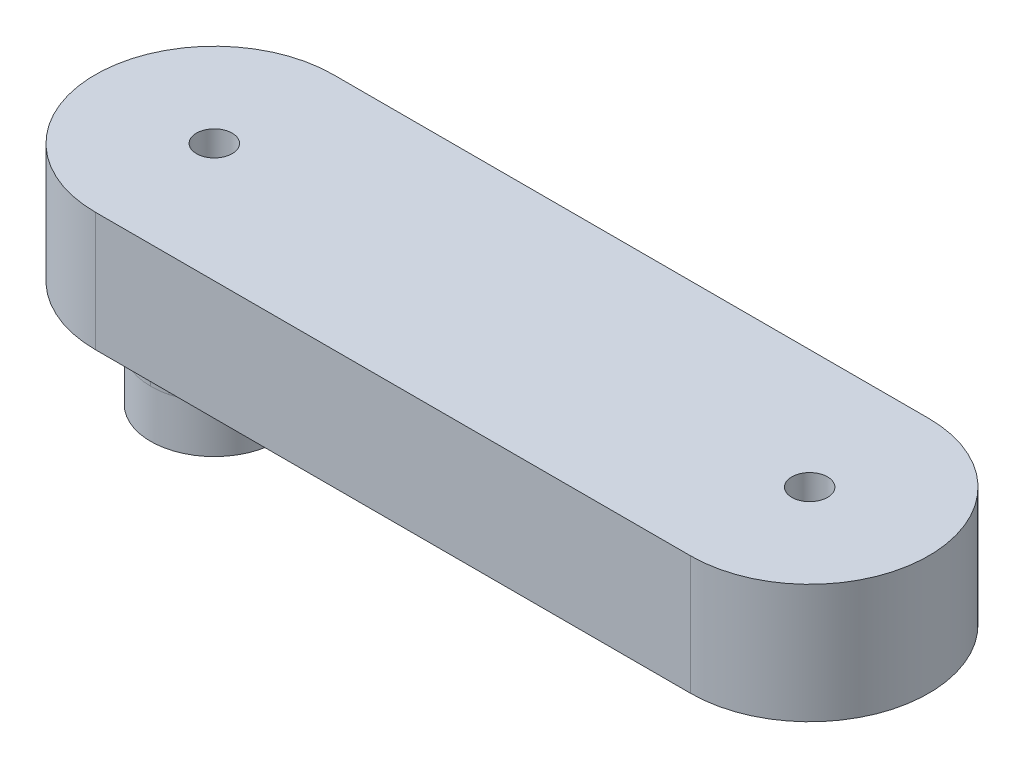
ISO-10303-21;
HEADER;
FILE_DESCRIPTION(('STEP AP214'),'2;1');
FILE_NAME('part.step','',(''),(''),'','','');
FILE_SCHEMA(('AUTOMOTIVE_DESIGN { 1 0 10303 214 1 1 1 1 }'));
ENDSEC;
DATA;
#1=APPLICATION_CONTEXT('core data for automotive mechanical design processes');
#2=APPLICATION_PROTOCOL_DEFINITION('international standard','automotive_design',2000,#1);
#3=PRODUCT_CONTEXT('',#1,'mechanical');
#4=PRODUCT('Part','Part','',(#3));
#5=PRODUCT_RELATED_PRODUCT_CATEGORY('part','',(#4));
#6=PRODUCT_DEFINITION_FORMATION('','',#4);
#7=PRODUCT_DEFINITION_CONTEXT('part definition',#1,'design');
#8=PRODUCT_DEFINITION('design','',#6,#7);
#9=PRODUCT_DEFINITION_SHAPE('','',#8);
#10=(LENGTH_UNIT() NAMED_UNIT(*) SI_UNIT(.MILLI.,.METRE.));
#11=(NAMED_UNIT(*) PLANE_ANGLE_UNIT() SI_UNIT($,.RADIAN.));
#12=(NAMED_UNIT(*) SI_UNIT($,.STERADIAN.) SOLID_ANGLE_UNIT());
#13=UNCERTAINTY_MEASURE_WITH_UNIT(LENGTH_MEASURE(1.E-05),#10,'distance_accuracy_value','');
#14=(GEOMETRIC_REPRESENTATION_CONTEXT(3) GLOBAL_UNCERTAINTY_ASSIGNED_CONTEXT((#13)) GLOBAL_UNIT_ASSIGNED_CONTEXT((#10,
#11,#12)) REPRESENTATION_CONTEXT('',''));
#15=CARTESIAN_POINT('',(0.,0.,0.));
#16=DIRECTION('',(0.,0.,1.));
#17=DIRECTION('',(1.,0.,0.));
#18=AXIS2_PLACEMENT_3D('',#15,#16,#17);
#19=CARTESIAN_POINT('',(-25.,10.,0.));
#20=DIRECTION('',(0.,-1.,0.));
#21=DIRECTION('',(0.,0.,-1.));
#22=AXIS2_PLACEMENT_3D('',#19,#20,#21);
#23=CYLINDRICAL_SURFACE('',#22,10.);
#24=CARTESIAN_POINT('',(-25.,0.,0.));
#25=DIRECTION('',(0.,1.,0.));
#26=DIRECTION('',(0.,0.,1.));
#27=AXIS2_PLACEMENT_3D('',#24,#25,#26);
#28=CIRCLE('',#27,10.);
#29=CARTESIAN_POINT('',(-25.,0.,-10.));
#30=VERTEX_POINT('',#29);
#31=CARTESIAN_POINT('',(-25.,0.,10.));
#32=VERTEX_POINT('',#31);
#33=EDGE_CURVE('E132',#30,#32,#28,.T.);
#34=ORIENTED_EDGE('',*,*,#33,.T.);
#35=DIRECTION('',(0.,-1.,0.));
#36=VECTOR('',#35,1.);
#37=CARTESIAN_POINT('',(-25.,10.,10.));
#38=LINE('',#37,#36);
#39=CARTESIAN_POINT('',(-25.,10.,10.));
#40=VERTEX_POINT('',#39);
#41=EDGE_CURVE('E113',#40,#32,#38,.T.);
#42=ORIENTED_EDGE('',*,*,#41,.F.);
#43=CARTESIAN_POINT('',(-25.,10.,0.));
#44=DIRECTION('',(0.,1.,0.));
#45=DIRECTION('',(0.,0.,1.));
#46=AXIS2_PLACEMENT_3D('',#43,#44,#45);
#47=CIRCLE('',#46,10.);
#48=CARTESIAN_POINT('',(-25.,10.,-10.));
#49=VERTEX_POINT('',#48);
#50=EDGE_CURVE('E120',#49,#40,#47,.T.);
#51=ORIENTED_EDGE('',*,*,#50,.F.);
#52=DIRECTION('',(0.,-1.,0.));
#53=VECTOR('',#52,1.);
#54=CARTESIAN_POINT('',(-25.,10.,-10.));
#55=LINE('',#54,#53);
#56=EDGE_CURVE('E237',#49,#30,#55,.T.);
#57=ORIENTED_EDGE('',*,*,#56,.T.);
#58=EDGE_LOOP('',(#34,#42,#51,#57));
#59=FACE_BOUND('',#58,.T.);
#60=ADVANCED_FACE('F43',(#59),#23,.T.);
#61=CARTESIAN_POINT('',(-25.,10.,10.));
#62=DIRECTION('',(0.,0.,-1.));
#63=DIRECTION('',(-1.,0.,0.));
#64=AXIS2_PLACEMENT_3D('',#61,#62,#63);
#65=PLANE('',#64);
#66=DIRECTION('',(1.,0.,0.));
#67=VECTOR('',#66,1.);
#68=CARTESIAN_POINT('',(-25.,0.,10.));
#69=LINE('',#68,#67);
#70=CARTESIAN_POINT('',(-22.3311987709835,0.,10.));
#71=VERTEX_POINT('',#70);
#72=EDGE_CURVE('E234',#32,#71,#69,.T.);
#73=ORIENTED_EDGE('',*,*,#72,.T.);
#74=CARTESIAN_POINT('',(25.,0.,9.99999999999999));
#75=VERTEX_POINT('',#74);
#76=EDGE_CURVE('E245',#71,#75,#69,.T.);
#77=ORIENTED_EDGE('',*,*,#76,.T.);
#78=DIRECTION('',(0.,-1.,0.));
#79=VECTOR('',#78,1.);
#80=CARTESIAN_POINT('',(25.,10.,9.99999999999999));
#81=LINE('',#80,#79);
#82=CARTESIAN_POINT('',(25.,10.,9.99999999999999));
#83=VERTEX_POINT('',#82);
#84=EDGE_CURVE('E116',#83,#75,#81,.T.);
#85=ORIENTED_EDGE('',*,*,#84,.F.);
#86=DIRECTION('',(1.,0.,0.));
#87=VECTOR('',#86,1.);
#88=CARTESIAN_POINT('',(-25.,10.,10.));
#89=LINE('',#88,#87);
#90=EDGE_CURVE('E108',#40,#83,#89,.T.);
#91=ORIENTED_EDGE('',*,*,#90,.F.);
#92=ORIENTED_EDGE('',*,*,#41,.T.);
#93=EDGE_LOOP('',(#73,#77,#85,#91,#92));
#94=FACE_BOUND('',#93,.T.);
#95=ADVANCED_FACE('F111',(#94),#65,.F.);
#96=CARTESIAN_POINT('',(25.,10.,0.));
#97=DIRECTION('',(0.,-1.,0.));
#98=DIRECTION('',(0.,0.,-1.));
#99=AXIS2_PLACEMENT_3D('',#96,#97,#98);
#100=CYLINDRICAL_SURFACE('',#99,10.);
#101=CARTESIAN_POINT('',(25.,0.,0.));
#102=DIRECTION('',(0.,1.,0.));
#103=DIRECTION('',(0.,0.,1.));
#104=AXIS2_PLACEMENT_3D('',#101,#102,#103);
#105=CIRCLE('',#104,10.);
#106=CARTESIAN_POINT('',(25.,0.,-10.));
#107=VERTEX_POINT('',#106);
#108=EDGE_CURVE('E231',#75,#107,#105,.T.);
#109=ORIENTED_EDGE('',*,*,#108,.T.);
#110=DIRECTION('',(0.,-1.,0.));
#111=VECTOR('',#110,1.);
#112=CARTESIAN_POINT('',(25.,10.,-10.));
#113=LINE('',#112,#111);
#114=CARTESIAN_POINT('',(25.,10.,-10.));
#115=VERTEX_POINT('',#114);
#116=EDGE_CURVE('E137',#115,#107,#113,.T.);
#117=ORIENTED_EDGE('',*,*,#116,.F.);
#118=CARTESIAN_POINT('',(25.,10.,0.));
#119=DIRECTION('',(0.,1.,0.));
#120=DIRECTION('',(0.,0.,1.));
#121=AXIS2_PLACEMENT_3D('',#118,#119,#120);
#122=CIRCLE('',#121,10.);
#123=EDGE_CURVE('E119',#83,#115,#122,.T.);
#124=ORIENTED_EDGE('',*,*,#123,.F.);
#125=ORIENTED_EDGE('',*,*,#84,.T.);
#126=EDGE_LOOP('',(#109,#117,#124,#125));
#127=FACE_BOUND('',#126,.T.);
#128=ADVANCED_FACE('F217',(#127),#100,.T.);
#129=CARTESIAN_POINT('',(-25.,10.,-10.));
#130=DIRECTION('',(0.,0.,1.));
#131=DIRECTION('',(1.,0.,0.));
#132=AXIS2_PLACEMENT_3D('',#129,#130,#131);
#133=PLANE('',#132);
#134=DIRECTION('',(-1.,0.,0.));
#135=VECTOR('',#134,1.);
#136=CARTESIAN_POINT('',(-25.,0.,-10.));
#137=LINE('',#136,#135);
#138=CARTESIAN_POINT('',(-22.3311987709835,0.,-10.));
#139=VERTEX_POINT('',#138);
#140=EDGE_CURVE('E129',#107,#139,#137,.T.);
#141=ORIENTED_EDGE('',*,*,#140,.T.);
#142=EDGE_CURVE('E233',#139,#30,#137,.T.);
#143=ORIENTED_EDGE('',*,*,#142,.T.);
#144=ORIENTED_EDGE('',*,*,#56,.F.);
#145=DIRECTION('',(-1.,0.,0.));
#146=VECTOR('',#145,1.);
#147=CARTESIAN_POINT('',(-25.,10.,-10.));
#148=LINE('',#147,#146);
#149=EDGE_CURVE('E125',#115,#49,#148,.T.);
#150=ORIENTED_EDGE('',*,*,#149,.F.);
#151=ORIENTED_EDGE('',*,*,#116,.T.);
#152=EDGE_LOOP('',(#141,#143,#144,#150,#151));
#153=FACE_BOUND('',#152,.T.);
#154=ADVANCED_FACE('F177',(#153),#133,.F.);
#155=CARTESIAN_POINT('',(-25.,10.,0.));
#156=DIRECTION('',(0.,1.,0.));
#157=DIRECTION('',(0.,0.,1.));
#158=AXIS2_PLACEMENT_3D('',#155,#156,#157);
#159=PLANE('',#158);
#160=CARTESIAN_POINT('',(-25.,10.,0.));
#161=DIRECTION('',(0.,1.,0.));
#162=DIRECTION('',(0.,0.,1.));
#163=AXIS2_PLACEMENT_3D('',#160,#161,#162);
#164=CIRCLE('',#163,1.5);
#165=CARTESIAN_POINT('',(-25.,10.,1.5));
#166=VERTEX_POINT('',#165);
#167=EDGE_CURVE('E254',#166,#166,#164,.F.);
#168=ORIENTED_EDGE('',*,*,#167,.T.);
#169=EDGE_LOOP('',(#168));
#170=FACE_BOUND('',#169,.T.);
#171=CARTESIAN_POINT('',(25.,10.,0.));
#172=DIRECTION('',(0.,1.,0.));
#173=DIRECTION('',(0.,0.,1.));
#174=AXIS2_PLACEMENT_3D('',#171,#172,#173);
#175=CIRCLE('',#174,1.5);
#176=CARTESIAN_POINT('',(25.,10.,1.49999999999999));
#177=VERTEX_POINT('',#176);
#178=EDGE_CURVE('E270',#177,#177,#175,.T.);
#179=ORIENTED_EDGE('',*,*,#178,.F.);
#180=EDGE_LOOP('',(#179));
#181=FACE_BOUND('',#180,.T.);
#182=ORIENTED_EDGE('',*,*,#50,.T.);
#183=ORIENTED_EDGE('',*,*,#90,.T.);
#184=ORIENTED_EDGE('',*,*,#123,.T.);
#185=ORIENTED_EDGE('',*,*,#149,.T.);
#186=EDGE_LOOP('',(#182,#183,#184,#185));
#187=FACE_BOUND('',#186,.T.);
#188=ADVANCED_FACE('F123',(#170,#181,#187),#159,.T.);
#189=CARTESIAN_POINT('',(-25.,0.,0.));
#190=DIRECTION('',(0.,1.,0.));
#191=DIRECTION('',(0.,0.,1.));
#192=AXIS2_PLACEMENT_3D('',#189,#190,#191);
#193=PLANE('',#192);
#194=CARTESIAN_POINT('',(25.,0.,0.));
#195=DIRECTION('',(0.,1.,0.));
#196=DIRECTION('',(0.,0.,1.));
#197=AXIS2_PLACEMENT_3D('',#194,#195,#196);
#198=CIRCLE('',#197,1.5);
#199=CARTESIAN_POINT('',(25.,0.,1.49999999999999));
#200=VERTEX_POINT('',#199);
#201=EDGE_CURVE('E246',#200,#200,#198,.F.);
#202=ORIENTED_EDGE('',*,*,#201,.F.);
#203=EDGE_LOOP('',(#202));
#204=FACE_BOUND('',#203,.T.);
#205=ORIENTED_EDGE('',*,*,#76,.F.);
#206=CARTESIAN_POINT('',(-25.,0.,0.));
#207=DIRECTION('',(0.,1.,0.));
#208=DIRECTION('',(0.,0.,1.));
#209=AXIS2_PLACEMENT_3D('',#206,#207,#208);
#210=CIRCLE('',#209,10.35);
#211=EDGE_CURVE('E11',#71,#139,#210,.T.);
#212=ORIENTED_EDGE('',*,*,#211,.T.);
#213=ORIENTED_EDGE('',*,*,#140,.F.);
#214=ORIENTED_EDGE('',*,*,#108,.F.);
#215=EDGE_LOOP('',(#205,#212,#213,#214));
#216=FACE_BOUND('',#215,.T.);
#217=ADVANCED_FACE('F174',(#204,#216),#193,.F.);
#218=CARTESIAN_POINT('',(25.,-0.000999999999999265,0.));
#219=DIRECTION('',(0.,1.,0.));
#220=DIRECTION('',(0.,0.,1.));
#221=AXIS2_PLACEMENT_3D('',#218,#219,#220);
#222=CYLINDRICAL_SURFACE('',#221,1.5);
#223=ORIENTED_EDGE('',*,*,#178,.T.);
#224=EDGE_LOOP('',(#223));
#225=FACE_BOUND('',#224,.T.);
#226=ORIENTED_EDGE('',*,*,#201,.T.);
#227=EDGE_LOOP('',(#226));
#228=FACE_BOUND('',#227,.T.);
#229=ADVANCED_FACE('F266',(#225,#228),#222,.F.);
#230=CARTESIAN_POINT('',(-25.,-9.,0.));
#231=DIRECTION('',(0.,1.,0.));
#232=DIRECTION('',(0.,0.,1.));
#233=AXIS2_PLACEMENT_3D('',#230,#231,#232);
#234=CYLINDRICAL_SURFACE('',#233,5.35);
#235=CARTESIAN_POINT('',(-25.,-5.,0.));
#236=DIRECTION('',(0.,1.,0.));
#237=DIRECTION('',(0.,0.,1.));
#238=AXIS2_PLACEMENT_3D('',#235,#236,#237);
#239=CIRCLE('',#238,5.35);
#240=CARTESIAN_POINT('',(-23.6204747270301,-5.,-5.16908212560387));
#241=VERTEX_POINT('',#240);
#242=CARTESIAN_POINT('',(-23.6204747270301,-5.,5.16908212560387));
#243=VERTEX_POINT('',#242);
#244=EDGE_CURVE('E133',#241,#243,#239,.F.);
#245=ORIENTED_EDGE('',*,*,#244,.T.);
#246=CARTESIAN_POINT('',(-22.4063247817949,-4.90937934062816,4.67924661270043));
#247=CARTESIAN_POINT('',(-22.8879748506339,0.975498043250479,4.94622203647995));
#248=CARTESIAN_POINT('',(-19.982329250762,0.,10.));
#249=CARTESIAN_POINT('',(-22.468087902895,-4.92215702125141,4.7134828290892));
#250=CARTESIAN_POINT('',(-22.9020255513305,0.90527144246055,4.9457728156593));
#251=CARTESIAN_POINT('',(-20.1018149149591,0.,10.));
#252=CARTESIAN_POINT('',(-22.5305936384705,-4.93311468699,4.74652914754896));
#253=CARTESIAN_POINT('',(-22.9210674061778,0.837164866416158,4.94901573193148));
#254=CARTESIAN_POINT('',(-20.2227372258345,0.,10.));
#255=CARTESIAN_POINT('',(-22.6569545492993,-4.95194389528001,4.81016000486057));
#256=CARTESIAN_POINT('',(-22.9683167428165,0.706727456995853,4.96116416599632));
#257=CARTESIAN_POINT('',(-20.4671924458317,0.,10.));
#258=CARTESIAN_POINT('',(-22.7208094807857,-4.95981599037782,4.84074498369482));
#259=CARTESIAN_POINT('',(-22.996430695619,0.644290788526217,4.97000691203827));
#260=CARTESIAN_POINT('',(-20.5907248833673,0.,10.));
#261=CARTESIAN_POINT('',(-22.914101894452,-4.9796272877734,4.92864537441296));
#262=CARTESIAN_POINT('',(-23.0928174155575,0.467291109513011,5.00221179667532));
#263=CARTESIAN_POINT('',(-20.9646644125965,0.,10.));
#264=CARTESIAN_POINT('',(-23.045388346509,-4.9877843263485,4.98217352822328));
#265=CARTESIAN_POINT('',(-23.1738131629906,0.36035783012853,5.03140402812189));
#266=CARTESIAN_POINT('',(-21.218648483424,0.,10.));
#267=CARTESIAN_POINT('',(-23.3085469853189,-4.99768796878871,5.07745985956556));
#268=CARTESIAN_POINT('',(-23.3603007018644,0.174145036372328,5.09358181809736));
#269=CARTESIAN_POINT('',(-21.7277497753456,0.,10.));
#270=CARTESIAN_POINT('',(-23.4403256872486,-4.99958701406536,5.11947470033271));
#271=CARTESIAN_POINT('',(-23.4649516265539,0.0935749025152531,5.1264658155242));
#272=CARTESIAN_POINT('',(-21.9826861426236,0.,10.));
#273=CARTESIAN_POINT('',(-23.7067656944101,-5.00029124399043,5.19318317312786));
#274=CARTESIAN_POINT('',(-23.6933077655576,-0.0448370798064056,5.18928403448164));
#275=CARTESIAN_POINT('',(-22.4981355022677,0.,10.));
#276=CARTESIAN_POINT('',(-23.8414274910527,-4.99909589698226,5.22487503048074));
#277=CARTESIAN_POINT('',(-23.8171590642594,-0.103227899936856,5.21936847159637));
#278=CARTESIAN_POINT('',(-22.7586494453069,0.,10.));
#279=CARTESIAN_POINT('',(-24.1153230647331,-4.99581213660066,5.27822633599849));
#280=CARTESIAN_POINT('',(-24.0802845511431,-0.199835553334219,5.27218728131988));
#281=CARTESIAN_POINT('',(-23.2885221906525,0.,10.));
#282=CARTESIAN_POINT('',(-24.2545952926233,-4.99370752498329,5.29968820730515));
#283=CARTESIAN_POINT('',(-24.2202075943135,-0.238070156897069,5.29496276846834));
#284=CARTESIAN_POINT('',(-23.5579553791874,0.,10.));
#285=CARTESIAN_POINT('',(-24.5343909129845,-4.99020537825828,5.33156033600395));
#286=CARTESIAN_POINT('',(-24.5075631984335,-0.294212329057783,5.3293078754699));
#287=CARTESIAN_POINT('',(-24.0992422335306,0.,10.));
#288=CARTESIAN_POINT('',(-24.6749142592356,-4.98880781713959,5.34197099996452));
#289=CARTESIAN_POINT('',(-24.6555353138538,-0.312355351759313,5.34101420045178));
#290=CARTESIAN_POINT('',(-24.371095809923,0.,10.));
#291=CARTESIAN_POINT('',(-24.9599527315156,-4.98750073565178,5.35179776405821));
#292=CARTESIAN_POINT('',(-24.9571017441589,-0.329418746312639,5.35199488366776));
#293=CARTESIAN_POINT('',(-24.9225253777918,0.,10.));
#294=CARTESIAN_POINT('',(-25.1044783247979,-4.98763004344253,5.35092692281945));
#295=CARTESIAN_POINT('',(-25.111405781805,-0.327912126433172,5.35099298670278));
#296=CARTESIAN_POINT('',(-25.2021216190016,0.,10.));
#297=CARTESIAN_POINT('',(-25.320833368275,-4.98894637096785,5.340860003256));
#298=CARTESIAN_POINT('',(-25.3396172782977,-0.310420525479363,5.33979122345231));
#299=CARTESIAN_POINT('',(-25.620677637691,0.,10.));
#300=CARTESIAN_POINT('',(-25.3928925362841,-4.98957242342615,5.33604258314774));
#301=CARTESIAN_POINT('',(-25.4153552384296,-0.302025929414769,5.33442455139388));
#302=CARTESIAN_POINT('',(-25.7600818225309,0.,10.));
#303=CARTESIAN_POINT('',(-25.5367558026473,-4.99108186619892,5.32349558536303));
#304=CARTESIAN_POINT('',(-25.5651430873869,-0.280067579465135,5.3206780454283));
#305=CARTESIAN_POINT('',(-26.0383967397009,0.,10.));
#306=CARTESIAN_POINT('',(-25.6085599023708,-4.99196525512985,5.31576602334332));
#307=CARTESIAN_POINT('',(-25.6392701624221,-0.266479800947126,5.31228369439717));
#308=CARTESIAN_POINT('',(-26.1773074746799,0.,10.));
#309=CARTESIAN_POINT('',(-25.6801859681807,-4.99291881518917,5.3065852531256));
#310=CARTESIAN_POINT('',(-25.7120499996823,-0.250271465370146,5.30250099440117));
#311=CARTESIAN_POINT('',(-26.3158737889103,0.,10.));
#312=(BOUNDED_SURFACE() B_SPLINE_SURFACE(3,2,((#246,#247,#248),(#249,#250,#251),(#252,#253,
#254),(#255,#256,#257),(#258,#259,#260),(#261,#262,#263),(#264,#265,#266),(#267,#268,#269),
(#270,#271,#272),(#273,#274,#275),(#276,#277,#278),(#279,#280,#281),(#282,#283,#284),(#285,#286,
#287),(#288,#289,#290),(#291,#292,#293),(#294,#295,#296),(#297,#298,#299),(#300,#301,#302),
(#303,#304,#305),(#306,#307,#308),(#309,#310,#311)),.UNSPECIFIED.,.F.,.F.,
.F.) B_SPLINE_SURFACE_WITH_KNOTS((4,2,2,2,2,2,2,2,2,2,4),(3,3),(0.,0.411542741492993,
0.823011752553321,1.645144449525,2.44709631854861,3.24918598240891,4.06619522460137,
4.88317440838842,5.72097312572852,6.14002468851432,6.55907399835985),(0.,1.),
.UNSPECIFIED.) GEOMETRIC_REPRESENTATION_ITEM() RATIONAL_B_SPLINE_SURFACE(((1.,0.645846913338497,
1.),(1.,0.649862634729996,1.),(1.,0.653798780730085,1.),(1.,0.661474206336515,1.),(1.,
0.665213521086353,1.),(1.,0.676074699999644,1.),(1.,0.682847801331046,1.),(1.,0.695078749137499,
1.),(1.,0.700564799930277,1.),(1.,0.710281907038307,1.),(1.,0.714512747553014,1.),(1.,
0.721677506720577,1.),(1.,0.724585837636818,1.),(1.,0.728916944876098,1.),(1.,0.730339775849909,
1.),(1.,0.731682421614335,1.),(1.,0.731563010207267,1.),(1.,0.730188276238598,1.),(1.,
0.72953053405369,1.),(1.,0.727821334129289,1.),(1.,0.726769878506541,1.),(1.,0.725524091352782,1.))) REPRESENTATION_ITEM('') SURFACE());
#313=CARTESIAN_POINT('',(-22.4063247817949,-4.90937934062816,4.67924661270043));
#314=CARTESIAN_POINT('',(-22.468087902895,-4.92215702125141,4.7134828290892));
#315=CARTESIAN_POINT('',(-22.5305936384705,-4.93311468699,4.74652914754896));
#316=CARTESIAN_POINT('',(-22.6569545492993,-4.95194389528001,4.81016000486057));
#317=CARTESIAN_POINT('',(-22.7208094807857,-4.95981599037782,4.84074498369482));
#318=CARTESIAN_POINT('',(-22.914101894452,-4.9796272877734,4.92864537441296));
#319=CARTESIAN_POINT('',(-23.045388346509,-4.9877843263485,4.98217352822328));
#320=CARTESIAN_POINT('',(-23.3085469853189,-4.99768796878871,5.07745985956556));
#321=CARTESIAN_POINT('',(-23.4403256872486,-4.99958701406536,5.11947470033271));
#322=CARTESIAN_POINT('',(-23.7067656944101,-5.00029124399043,5.19318317312786));
#323=CARTESIAN_POINT('',(-23.8414274910527,-4.99909589698226,5.22487503048074));
#324=CARTESIAN_POINT('',(-24.1153230647331,-4.99581213660066,5.27822633599849));
#325=CARTESIAN_POINT('',(-24.2545952926234,-4.99370752498329,5.29968820730515));
#326=CARTESIAN_POINT('',(-24.5343909129845,-4.99020537825828,5.33156033600395));
#327=CARTESIAN_POINT('',(-24.6749142592356,-4.98880781713959,5.34197099996452));
#328=CARTESIAN_POINT('',(-24.9599527315156,-4.98750073565178,5.35179776405821));
#329=CARTESIAN_POINT('',(-25.1044783247979,-4.98763004344254,5.35092692281945));
#330=CARTESIAN_POINT('',(-25.320833368275,-4.98894637096785,5.340860003256));
#331=CARTESIAN_POINT('',(-25.3928925362841,-4.98957242342615,5.33604258314774));
#332=CARTESIAN_POINT('',(-25.5367558026473,-4.99108186619892,5.32349558536303));
#333=CARTESIAN_POINT('',(-25.6085599023708,-4.99196525512985,5.31576602334332));
#334=CARTESIAN_POINT('',(-25.6801859681807,-4.99291881518917,5.3065852531256));
#335=B_SPLINE_CURVE_WITH_KNOTS('',3,(#313,#314,#315,#316,#317,#318,#319,#320,#321,#322,#323,
#324,#325,#326,#327,#328,#329,#330,#331,#332,#333,#334),.UNSPECIFIED.,.F.,.F.,(4,2,2,2,2,2,2,2,
2,2,4),(0.,0.411542741492993,0.823011752553321,1.645144449525,2.44709631854861,3.24918598240891,
4.06619522460137,4.88317440838842,5.72097312572852,6.14002468851432,6.55907399835985),.UNSPECIFIED.);
#336=CARTESIAN_POINT('',(-25.,-4.98773495687171,5.35));
#337=VERTEX_POINT('',#336);
#338=EDGE_CURVE('E56',#243,#337,#335,.T.);
#339=ORIENTED_EDGE('',*,*,#338,.T.);
#340=CARTESIAN_POINT('',(-25.,-4.98773495687171,0.));
#341=DIRECTION('',(0.,1.,0.));
#342=DIRECTION('',(0.,0.,1.));
#343=AXIS2_PLACEMENT_3D('',#340,#341,#342);
#344=CIRCLE('',#343,5.35);
#345=CARTESIAN_POINT('',(-25.,-4.98773495687171,-5.35));
#346=VERTEX_POINT('',#345);
#347=EDGE_CURVE('E148',#337,#346,#344,.F.);
#348=ORIENTED_EDGE('',*,*,#347,.T.);
#349=CARTESIAN_POINT('',(-26.0228866606093,-4.99746914629356,-5.25130487398585));
#350=CARTESIAN_POINT('',(-26.0518342041425,-0.151327584497428,-5.24566626475481));
#351=CARTESIAN_POINT('',(-26.9788555023003,0.,-10.));
#352=CARTESIAN_POINT('',(-25.9519816330296,-4.99661173471191,-5.26511615605325));
#353=CARTESIAN_POINT('',(-25.9838925193806,-0.176275219698127,-5.25932344975122));
#354=CARTESIAN_POINT('',(-26.8416840938048,0.,-10.));
#355=CARTESIAN_POINT('',(-25.8808053789332,-4.9956432876798,-5.27748969279492));
#356=CARTESIAN_POINT('',(-25.9139269500573,-0.198492678012398,-5.27196649699026));
#357=CARTESIAN_POINT('',(-26.703987976067,0.,-10.));
#358=CARTESIAN_POINT('',(-25.7380099362557,-4.99369141658507,-5.29934522958744));
#359=CARTESIAN_POINT('',(-25.7712171581687,-0.23745274121478,-5.29471475920545));
#360=CARTESIAN_POINT('',(-26.4277388486444,0.,-10.));
#361=CARTESIAN_POINT('',(-25.6663907450769,-4.99270799243456,-5.30882721266284));
#362=CARTESIAN_POINT('',(-25.6984091257832,-0.254238109499981,-5.30484226443355));
#363=CARTESIAN_POINT('',(-26.2891858339339,0.,-10.));
#364=CARTESIAN_POINT('',(-25.4510695281324,-4.99004653847853,-5.33290592711733));
#365=CARTESIAN_POINT('',(-25.4773319962797,-0.296564774639448,-5.33077347696277));
#366=CARTESIAN_POINT('',(-25.8726298347986,0.,-10.));
#367=CARTESIAN_POINT('',(-25.3068541100363,-4.98865643752529,-5.34314510868886));
#368=CARTESIAN_POINT('',(-25.3252574445491,-0.314398026885511,-5.34231726020473));
#369=CARTESIAN_POINT('',(-25.5936336521263,0.,-10.));
#370=CARTESIAN_POINT('',(-25.0217769295541,-4.98749388985973,-5.35180766924487));
#371=CARTESIAN_POINT('',(-25.0234398128161,-0.329434998305688,-5.35201856702636));
#372=CARTESIAN_POINT('',(-25.0421292001654,0.,-10.));
#373=CARTESIAN_POINT('',(-24.880923678495,-4.98768099912332,-5.35052640691505));
#374=CARTESIAN_POINT('',(-24.8731180834523,-0.327217293838509,-5.35055142617128));
#375=CARTESIAN_POINT('',(-24.7696373967144,0.,-10.));
#376=CARTESIAN_POINT('',(-24.5997502113895,-4.989470825283,-5.33686337690267));
#377=CARTESIAN_POINT('',(-24.576495502657,-0.303458308736668,-5.33532802825332));
#378=CARTESIAN_POINT('',(-24.2256849883891,0.,-10.));
#379=CARTESIAN_POINT('',(-24.4594300192166,-4.9910736048473,-5.3244811178061));
#380=CARTESIAN_POINT('',(-24.4295879130414,-0.281817197515283,-5.32150804622998));
#381=CARTESIAN_POINT('',(-23.9542244296997,0.,-10.));
#382=CARTESIAN_POINT('',(-24.1727564785887,-4.99486237568772,-5.28773553453734));
#383=CARTESIAN_POINT('',(-24.1377340144726,-0.216815216529236,-5.28234281094893));
#384=CARTESIAN_POINT('',(-23.3996316922226,0.,-10.));
#385=CARTESIAN_POINT('',(-24.0264801992908,-4.99707489892725,-5.2627687936572));
#386=CARTESIAN_POINT('',(-23.9927750299324,-0.172067422348057,-5.256259441982));
#387=CARTESIAN_POINT('',(-23.1166486098414,0.,-10.));
#388=CARTESIAN_POINT('',(-23.7365131495399,-4.99998286469731,-5.20077750969058));
#389=CARTESIAN_POINT('',(-23.7201965933415,-0.0589137193665749,-5.19658457594004));
#390=CARTESIAN_POINT('',(-22.5556843173357,0.,-10.));
#391=CARTESIAN_POINT('',(-23.5928222981303,-5.00067835481242,-5.16375334484967));
#392=CARTESIAN_POINT('',(-23.5921846311864,0.0100164515104532,-5.16277477656473));
#393=CARTESIAN_POINT('',(-22.2777029505943,0.,-10.));
#394=CARTESIAN_POINT('',(-23.3050421814323,-4.99753497146377,-5.0766944689985));
#395=CARTESIAN_POINT('',(-23.3571871109459,0.175551584476233,-5.09328951321567));
#396=CARTESIAN_POINT('',(-21.720969453793,0.,-10.));
#397=CARTESIAN_POINT('',(-23.1610529765808,-4.99356945320689,-5.02632655407054));
#398=CARTESIAN_POINT('',(-23.2508597913106,0.27363499352601,-5.05743919766299));
#399=CARTESIAN_POINT('',(-21.4424108985969,0.,-10.));
#400=CARTESIAN_POINT('',(-22.9487727428786,-4.98091755986846,-4.94173859701555));
#401=CARTESIAN_POINT('',(-23.1172209488664,0.440573720836214,-5.01123762346318));
#402=CARTESIAN_POINT('',(-21.031737923125,0.,-10.));
#403=CARTESIAN_POINT('',(-22.8786048878471,-4.97557980590995,-4.91202404726421));
#404=CARTESIAN_POINT('',(-23.0766921001863,0.500169151962237,-4.99699131325034));
#405=CARTESIAN_POINT('',(-20.8959926334928,0.,-10.));
#406=CARTESIAN_POINT('',(-22.7396529259375,-4.96203528700234,-4.84965282784347));
#407=CARTESIAN_POINT('',(-23.0050059401995,0.626198699088739,-4.97275664154473));
#408=CARTESIAN_POINT('',(-20.6271790249498,0.,-10.));
#409=CARTESIAN_POINT('',(-22.6708690311674,-4.95382808576641,-4.81699571133053));
#410=CARTESIAN_POINT('',(-22.9739300041018,0.692765411267942,-4.96280867491815));
#411=CARTESIAN_POINT('',(-20.4941111163786,0.,-10.));
#412=CARTESIAN_POINT('',(-22.6028528619615,-4.94387071662594,-4.78290556028382));
#413=CARTESIAN_POINT('',(-22.9482532363106,0.762217639042707,-4.95601696890614));
#414=CARTESIAN_POINT('',(-20.3625284338882,0.,-10.));
#415=(BOUNDED_SURFACE() B_SPLINE_SURFACE(3,2,((#349,#350,#351),(#352,#353,#354),(#355,#356,
#357),(#358,#359,#360),(#361,#362,#363),(#364,#365,#366),(#367,#368,#369),(#370,#371,#372),
(#373,#374,#375),(#376,#377,#378),(#379,#380,#381),(#382,#383,#384),(#385,#386,#387),(#388,#389,
#390),(#391,#392,#393),(#394,#395,#396),(#397,#398,#399),(#400,#401,#402),(#403,#404,#405),
(#406,#407,#408),(#409,#410,#411),(#412,#413,#414)),.UNSPECIFIED.,.F.,.F.,
.F.) B_SPLINE_SURFACE_WITH_KNOTS((4,2,2,2,2,2,2,2,2,2,4),(3,3),(0.,0.41919544062289,
0.838393342170593,1.67649585344164,2.49317378017277,3.30988786102549,4.17013299968638,
5.03035115475904,5.91449315288708,6.35688857993051,6.7993513005261),(0.,1.),
.UNSPECIFIED.) GEOMETRIC_REPRESENTATION_ITEM() RATIONAL_B_SPLINE_SURFACE(((1.,0.718062116433734,
1.),(1.,0.719917164011899,1.),(1.,0.72158575518807,1.),(1.,0.724540971110069,1.),(1.,
0.725827593613473,1.),(1.,0.72910013465956,1.),(1.,0.730500037216757,1.),(1.,0.73168395531896,
1.),(1.,0.731508363306906,1.),(1.,0.729642437825001,1.),(1.,0.727952037298279,1.),(1.,
0.722966735302251,1.),(1.,0.719591115830581,1.),(1.,0.711296811271779,1.),(1.,0.706378174589809,
1.),(1.,0.694983923227657,1.),(1.,0.688468811289004,1.),(1.,0.677760266484751,1.),(1.,
0.674033234201927,1.),(1.,0.666305585787939,1.),(1.,0.662304928127688,1.),(1.,0.658187012948064,1.))) REPRESENTATION_ITEM('') SURFACE());
#416=CARTESIAN_POINT('',(-26.0228866606093,-4.99746914629356,-5.25130487398585));
#417=CARTESIAN_POINT('',(-25.9519816330296,-4.99661173471191,-5.26511615605325));
#418=CARTESIAN_POINT('',(-25.8808053789332,-4.9956432876798,-5.27748969279492));
#419=CARTESIAN_POINT('',(-25.7380099362557,-4.99369141658507,-5.29934522958744));
#420=CARTESIAN_POINT('',(-25.6663907450769,-4.99270799243456,-5.30882721266284));
#421=CARTESIAN_POINT('',(-25.4510695281324,-4.99004653847853,-5.33290592711733));
#422=CARTESIAN_POINT('',(-25.3068541100363,-4.98865643752529,-5.34314510868886));
#423=CARTESIAN_POINT('',(-25.0217769295541,-4.98749388985973,-5.35180766924487));
#424=CARTESIAN_POINT('',(-24.880923678495,-4.98768099912332,-5.35052640691505));
#425=CARTESIAN_POINT('',(-24.5997502113895,-4.989470825283,-5.33686337690267));
#426=CARTESIAN_POINT('',(-24.4594300192166,-4.9910736048473,-5.3244811178061));
#427=CARTESIAN_POINT('',(-24.1727564785887,-4.99486237568772,-5.28773553453734));
#428=CARTESIAN_POINT('',(-24.0264801992908,-4.99707489892725,-5.2627687936572));
#429=CARTESIAN_POINT('',(-23.7365131495399,-4.99998286469731,-5.20077750969058));
#430=CARTESIAN_POINT('',(-23.5928222981303,-5.00067835481242,-5.16375334484967));
#431=CARTESIAN_POINT('',(-23.3050421814323,-4.99753497146377,-5.0766944689985));
#432=CARTESIAN_POINT('',(-23.1610529765808,-4.99356945320689,-5.02632655407054));
#433=CARTESIAN_POINT('',(-22.9487727428786,-4.98091755986846,-4.94173859701555));
#434=CARTESIAN_POINT('',(-22.8786048878471,-4.97557980590995,-4.91202404726421));
#435=CARTESIAN_POINT('',(-22.7396529259375,-4.96203528700234,-4.84965282784346));
#436=CARTESIAN_POINT('',(-22.6708690311674,-4.95382808576641,-4.81699571133053));
#437=CARTESIAN_POINT('',(-22.6028528619615,-4.94387071662594,-4.78290556028382));
#438=B_SPLINE_CURVE_WITH_KNOTS('',3,(#416,#417,#418,#419,#420,#421,#422,#423,#424,#425,#426,
#427,#428,#429,#430,#431,#432,#433,#434,#435,#436,#437),.UNSPECIFIED.,.F.,.F.,(4,2,2,2,2,2,2,2,
2,2,4),(0.,0.41919544062289,0.838393342170593,1.67649585344164,2.49317378017277,
3.30988786102549,4.17013299968638,5.03035115475904,5.91449315288708,6.35688857993051,
6.7993513005261),.UNSPECIFIED.);
#439=EDGE_CURVE('E135',#346,#241,#438,.T.);
#440=ORIENTED_EDGE('',*,*,#439,.T.);
#441=EDGE_LOOP('',(#245,#339,#348,#440));
#442=FACE_BOUND('',#441,.T.);
#443=CARTESIAN_POINT('',(-25.,-9.,0.));
#444=DIRECTION('',(0.,-1.,0.));
#445=DIRECTION('',(0.,0.,-1.));
#446=AXIS2_PLACEMENT_3D('',#443,#444,#445);
#447=CIRCLE('',#446,5.35);
#448=CARTESIAN_POINT('',(-25.,-9.,-5.35));
#449=VERTEX_POINT('',#448);
#450=EDGE_CURVE('E185',#449,#449,#447,.T.);
#451=ORIENTED_EDGE('',*,*,#450,.F.);
#452=EDGE_LOOP('',(#451));
#453=FACE_BOUND('',#452,.T.);
#454=ADVANCED_FACE('F150',(#442,#453),#234,.T.);
#455=CARTESIAN_POINT('',(-25.,-9.,0.));
#456=DIRECTION('',(0.,-1.,0.));
#457=DIRECTION('',(0.,0.,-1.));
#458=AXIS2_PLACEMENT_3D('',#455,#456,#457);
#459=PLANE('',#458);
#460=CARTESIAN_POINT('',(-25.,-9.,0.));
#461=DIRECTION('',(0.,-1.,0.));
#462=DIRECTION('',(0.,0.,-1.));
#463=AXIS2_PLACEMENT_3D('',#460,#461,#462);
#464=CIRCLE('',#463,1.5);
#465=CARTESIAN_POINT('',(-25.,-9.,-1.5));
#466=VERTEX_POINT('',#465);
#467=EDGE_CURVE('E251',#466,#466,#464,.T.);
#468=ORIENTED_EDGE('',*,*,#467,.F.);
#469=EDGE_LOOP('',(#468));
#470=FACE_BOUND('',#469,.T.);
#471=ORIENTED_EDGE('',*,*,#450,.T.);
#472=EDGE_LOOP('',(#471));
#473=FACE_BOUND('',#472,.T.);
#474=ADVANCED_FACE('F167',(#470,#473),#459,.T.);
#475=CARTESIAN_POINT('',(-25.,-4.98773495687171,-10.35));
#476=DIRECTION('',(-1.,0.,0.));
#477=DIRECTION('',(0.,-1.,0.));
#478=AXIS2_PLACEMENT_3D('',#475,#476,#477);
#479=CIRCLE('',#478,5.);
#480=EDGE_CURVE('E186',#30,#346,#479,.F.);
#481=ORIENTED_EDGE('',*,*,#480,.F.);
#482=ORIENTED_EDGE('',*,*,#142,.F.);
#483=CARTESIAN_POINT('',(-22.3311987709835,-5.,-10.));
#484=DIRECTION('',(-0.966183574879227,0.,-0.257855191209324));
#485=DIRECTION('',(-0.257855191209324,0.,0.966183574879227));
#486=AXIS2_PLACEMENT_3D('',#483,#484,#485);
#487=CIRCLE('',#486,5.);
#488=EDGE_CURVE('E182',#241,#139,#487,.T.);
#489=ORIENTED_EDGE('',*,*,#488,.F.);
#490=ORIENTED_EDGE('',*,*,#439,.F.);
#491=EDGE_LOOP('',(#481,#482,#489,#490));
#492=FACE_BOUND('',#491,.T.);
#493=ADVANCED_FACE('F161',(#492),#415,.F.);
#494=CARTESIAN_POINT('',(-25.,-5.,0.));
#495=DIRECTION('',(0.,1.,0.));
#496=DIRECTION('',(0.,0.,1.));
#497=AXIS2_PLACEMENT_3D('',#494,#495,#496);
#498=TOROIDAL_SURFACE('',#497,10.35,5.);
#499=ORIENTED_EDGE('',*,*,#488,.T.);
#500=ORIENTED_EDGE('',*,*,#211,.F.);
#501=CARTESIAN_POINT('',(-22.3311987709835,-5.,10.));
#502=DIRECTION('',(0.966183574879227,0.,-0.257855191209324));
#503=DIRECTION('',(-0.257855191209324,0.,-0.966183574879227));
#504=AXIS2_PLACEMENT_3D('',#501,#502,#503);
#505=CIRCLE('',#504,5.);
#506=EDGE_CURVE('E64',#243,#71,#505,.T.);
#507=ORIENTED_EDGE('',*,*,#506,.F.);
#508=ORIENTED_EDGE('',*,*,#244,.F.);
#509=EDGE_LOOP('',(#499,#500,#507,#508));
#510=FACE_BOUND('',#509,.T.);
#511=ADVANCED_FACE('F166',(#510),#498,.F.);
#512=CARTESIAN_POINT('',(-25.,-4.98773495687171,0.));
#513=DIRECTION('',(0.,1.,0.));
#514=DIRECTION('',(0.,0.,1.));
#515=AXIS2_PLACEMENT_3D('',#512,#513,#514);
#516=TOROIDAL_SURFACE('',#515,10.35,5.);
#517=ORIENTED_EDGE('',*,*,#480,.T.);
#518=ORIENTED_EDGE('',*,*,#347,.F.);
#519=CARTESIAN_POINT('',(-25.,-4.98773495687171,10.35));
#520=DIRECTION('',(-1.,0.,0.));
#521=DIRECTION('',(0.,0.,1.));
#522=AXIS2_PLACEMENT_3D('',#519,#520,#521);
#523=CIRCLE('',#522,5.);
#524=EDGE_CURVE('E248',#32,#337,#523,.T.);
#525=ORIENTED_EDGE('',*,*,#524,.F.);
#526=ORIENTED_EDGE('',*,*,#33,.F.);
#527=EDGE_LOOP('',(#517,#518,#525,#526));
#528=FACE_BOUND('',#527,.T.);
#529=ADVANCED_FACE('F202',(#528),#516,.F.);
#530=ORIENTED_EDGE('',*,*,#506,.T.);
#531=ORIENTED_EDGE('',*,*,#72,.F.);
#532=ORIENTED_EDGE('',*,*,#524,.T.);
#533=ORIENTED_EDGE('',*,*,#338,.F.);
#534=EDGE_LOOP('',(#530,#531,#532,#533));
#535=FACE_BOUND('',#534,.T.);
#536=ADVANCED_FACE('F204',(#535),#312,.F.);
#537=CARTESIAN_POINT('',(-25.,10.001,0.));
#538=DIRECTION('',(0.,-1.,0.));
#539=DIRECTION('',(0.,0.,-1.));
#540=AXIS2_PLACEMENT_3D('',#537,#538,#539);
#541=CYLINDRICAL_SURFACE('',#540,1.5);
#542=ORIENTED_EDGE('',*,*,#167,.F.);
#543=EDGE_LOOP('',(#542));
#544=FACE_BOUND('',#543,.T.);
#545=ORIENTED_EDGE('',*,*,#467,.T.);
#546=EDGE_LOOP('',(#545));
#547=FACE_BOUND('',#546,.T.);
#548=ADVANCED_FACE('F210',(#544,#547),#541,.F.);
#549=CLOSED_SHELL('',(#60,#95,#128,#154,#188,#217,#229,#454,#474,#493,#511,#529,#536,#548));
#550=MANIFOLD_SOLID_BREP('B2',#549);
#551=ADVANCED_BREP_SHAPE_REPRESENTATION('',(#18,#550),#14);
#552=SHAPE_DEFINITION_REPRESENTATION(#9,#551);
ENDSEC;
END-ISO-10303-21;
